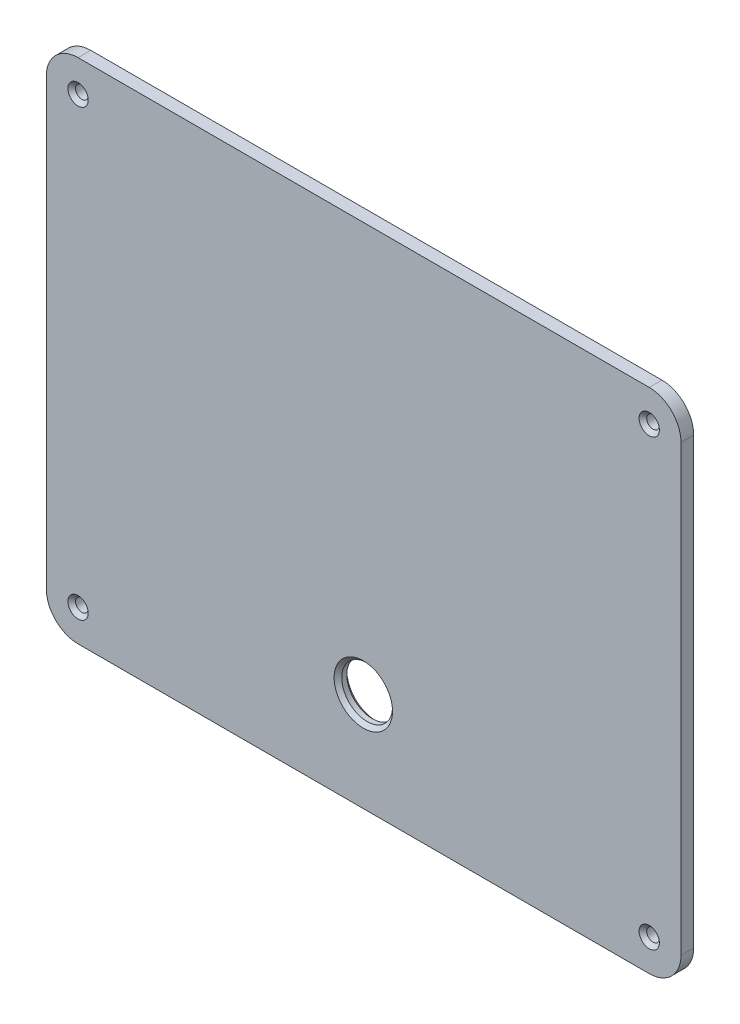
ISO-10303-21;
HEADER;
FILE_DESCRIPTION(('STEP AP214'),'2;1');
FILE_NAME('part.step','',(''),(''),'','','');
FILE_SCHEMA(('AUTOMOTIVE_DESIGN { 1 0 10303 214 1 1 1 1 }'));
ENDSEC;
DATA;
#1=APPLICATION_CONTEXT('core data for automotive mechanical design processes');
#2=APPLICATION_PROTOCOL_DEFINITION('international standard','automotive_design',2000,#1);
#3=PRODUCT_CONTEXT('',#1,'mechanical');
#4=PRODUCT('Part','Part','',(#3));
#5=PRODUCT_RELATED_PRODUCT_CATEGORY('part','',(#4));
#6=PRODUCT_DEFINITION_FORMATION('','',#4);
#7=PRODUCT_DEFINITION_CONTEXT('part definition',#1,'design');
#8=PRODUCT_DEFINITION('design','',#6,#7);
#9=PRODUCT_DEFINITION_SHAPE('','',#8);
#10=(LENGTH_UNIT() NAMED_UNIT(*) SI_UNIT(.MILLI.,.METRE.));
#11=(NAMED_UNIT(*) PLANE_ANGLE_UNIT() SI_UNIT($,.RADIAN.));
#12=(NAMED_UNIT(*) SI_UNIT($,.STERADIAN.) SOLID_ANGLE_UNIT());
#13=UNCERTAINTY_MEASURE_WITH_UNIT(LENGTH_MEASURE(1.E-05),#10,'distance_accuracy_value','');
#14=(GEOMETRIC_REPRESENTATION_CONTEXT(3) GLOBAL_UNCERTAINTY_ASSIGNED_CONTEXT((#13)) GLOBAL_UNIT_ASSIGNED_CONTEXT((#10,
#11,#12)) REPRESENTATION_CONTEXT('',''));
#15=CARTESIAN_POINT('',(0.,0.,0.));
#16=DIRECTION('',(0.,0.,1.));
#17=DIRECTION('',(1.,0.,0.));
#18=AXIS2_PLACEMENT_3D('',#15,#16,#17);
#19=CARTESIAN_POINT('',(-224.722989012424,-174.030461543485,10.));
#20=DIRECTION('',(0.,0.,-1.));
#21=DIRECTION('',(-1.,0.,0.));
#22=AXIS2_PLACEMENT_3D('',#19,#20,#21);
#23=CYLINDRICAL_SURFACE('',#22,25.);
#24=CARTESIAN_POINT('',(-224.722989012424,-174.030461543485,0.));
#25=DIRECTION('',(0.,0.,1.));
#26=DIRECTION('',(1.,0.,0.));
#27=AXIS2_PLACEMENT_3D('',#24,#25,#26);
#28=CIRCLE('',#27,25.);
#29=CARTESIAN_POINT('',(-249.722989012424,-174.030461543485,0.));
#30=VERTEX_POINT('',#29);
#31=CARTESIAN_POINT('',(-224.722989012424,-199.030461543485,0.));
#32=VERTEX_POINT('',#31);
#33=EDGE_CURVE('E136',#30,#32,#28,.T.);
#34=ORIENTED_EDGE('',*,*,#33,.T.);
#35=DIRECTION('',(0.,0.,-1.));
#36=VECTOR('',#35,1.);
#37=CARTESIAN_POINT('',(-224.722989012424,-199.030461543485,10.));
#38=LINE('',#37,#36);
#39=CARTESIAN_POINT('',(-224.722989012424,-199.030461543485,10.));
#40=VERTEX_POINT('',#39);
#41=EDGE_CURVE('E164',#40,#32,#38,.T.);
#42=ORIENTED_EDGE('',*,*,#41,.F.);
#43=CARTESIAN_POINT('',(-224.722989012424,-174.030461543485,10.));
#44=DIRECTION('',(0.,0.,1.));
#45=DIRECTION('',(1.,0.,0.));
#46=AXIS2_PLACEMENT_3D('',#43,#44,#45);
#47=CIRCLE('',#46,25.);
#48=CARTESIAN_POINT('',(-249.722989012424,-174.030461543485,10.));
#49=VERTEX_POINT('',#48);
#50=EDGE_CURVE('E151',#49,#40,#47,.T.);
#51=ORIENTED_EDGE('',*,*,#50,.F.);
#52=DIRECTION('',(0.,0.,-1.));
#53=VECTOR('',#52,1.);
#54=CARTESIAN_POINT('',(-249.722989012424,-174.030461543485,10.));
#55=LINE('',#54,#53);
#56=EDGE_CURVE('E132',#49,#30,#55,.T.);
#57=ORIENTED_EDGE('',*,*,#56,.T.);
#58=EDGE_LOOP('',(#34,#42,#51,#57));
#59=FACE_BOUND('',#58,.T.);
#60=ADVANCED_FACE('F37',(#59),#23,.T.);
#61=CARTESIAN_POINT('',(-224.722989012424,-199.030461543485,10.));
#62=DIRECTION('',(0.,1.,0.));
#63=DIRECTION('',(-1.,0.,0.));
#64=AXIS2_PLACEMENT_3D('',#61,#62,#63);
#65=PLANE('',#64);
#66=DIRECTION('',(1.,0.,0.));
#67=VECTOR('',#66,1.);
#68=CARTESIAN_POINT('',(-224.722989012424,-199.030461543485,0.));
#69=LINE('',#68,#67);
#70=CARTESIAN_POINT('',(225.277010987576,-199.030461543485,0.));
#71=VERTEX_POINT('',#70);
#72=EDGE_CURVE('E139',#32,#71,#69,.T.);
#73=ORIENTED_EDGE('',*,*,#72,.T.);
#74=DIRECTION('',(0.,0.,-1.));
#75=VECTOR('',#74,1.);
#76=CARTESIAN_POINT('',(225.277010987576,-199.030461543485,10.));
#77=LINE('',#76,#75);
#78=CARTESIAN_POINT('',(225.277010987576,-199.030461543485,10.));
#79=VERTEX_POINT('',#78);
#80=EDGE_CURVE('E161',#79,#71,#77,.T.);
#81=ORIENTED_EDGE('',*,*,#80,.F.);
#82=DIRECTION('',(1.,0.,0.));
#83=VECTOR('',#82,1.);
#84=CARTESIAN_POINT('',(-224.722989012424,-199.030461543485,10.));
#85=LINE('',#84,#83);
#86=EDGE_CURVE('E99',#40,#79,#85,.T.);
#87=ORIENTED_EDGE('',*,*,#86,.F.);
#88=ORIENTED_EDGE('',*,*,#41,.T.);
#89=EDGE_LOOP('',(#73,#81,#87,#88));
#90=FACE_BOUND('',#89,.T.);
#91=ADVANCED_FACE('F243',(#90),#65,.F.);
#92=CARTESIAN_POINT('',(225.277010987576,-174.030461543485,10.));
#93=DIRECTION('',(0.,0.,-1.));
#94=DIRECTION('',(-1.,0.,0.));
#95=AXIS2_PLACEMENT_3D('',#92,#93,#94);
#96=CYLINDRICAL_SURFACE('',#95,25.);
#97=CARTESIAN_POINT('',(225.277010987576,-174.030461543485,0.));
#98=DIRECTION('',(0.,0.,1.));
#99=DIRECTION('',(1.,0.,0.));
#100=AXIS2_PLACEMENT_3D('',#97,#98,#99);
#101=CIRCLE('',#100,25.);
#102=CARTESIAN_POINT('',(250.277010987576,-174.030461543485,0.));
#103=VERTEX_POINT('',#102);
#104=EDGE_CURVE('E142',#71,#103,#101,.T.);
#105=ORIENTED_EDGE('',*,*,#104,.T.);
#106=DIRECTION('',(0.,0.,-1.));
#107=VECTOR('',#106,1.);
#108=CARTESIAN_POINT('',(250.277010987576,-174.030461543485,10.));
#109=LINE('',#108,#107);
#110=CARTESIAN_POINT('',(250.277010987576,-174.030461543485,10.));
#111=VERTEX_POINT('',#110);
#112=EDGE_CURVE('E158',#111,#103,#109,.T.);
#113=ORIENTED_EDGE('',*,*,#112,.F.);
#114=CARTESIAN_POINT('',(225.277010987576,-174.030461543485,10.));
#115=DIRECTION('',(0.,0.,1.));
#116=DIRECTION('',(1.,0.,0.));
#117=AXIS2_PLACEMENT_3D('',#114,#115,#116);
#118=CIRCLE('',#117,25.);
#119=EDGE_CURVE('E305',#79,#111,#118,.T.);
#120=ORIENTED_EDGE('',*,*,#119,.F.);
#121=ORIENTED_EDGE('',*,*,#80,.T.);
#122=EDGE_LOOP('',(#105,#113,#120,#121));
#123=FACE_BOUND('',#122,.T.);
#124=ADVANCED_FACE('F248',(#123),#96,.T.);
#125=CARTESIAN_POINT('',(250.277010987576,-174.030461543485,10.));
#126=DIRECTION('',(-1.,0.,0.));
#127=DIRECTION('',(0.,0.,1.));
#128=AXIS2_PLACEMENT_3D('',#125,#126,#127);
#129=PLANE('',#128);
#130=DIRECTION('',(0.,1.,0.));
#131=VECTOR('',#130,1.);
#132=CARTESIAN_POINT('',(250.277010987576,-174.030461543485,0.));
#133=LINE('',#132,#131);
#134=CARTESIAN_POINT('',(250.277010987576,175.969538456515,0.));
#135=VERTEX_POINT('',#134);
#136=EDGE_CURVE('E144',#103,#135,#133,.T.);
#137=ORIENTED_EDGE('',*,*,#136,.T.);
#138=DIRECTION('',(0.,0.,-1.));
#139=VECTOR('',#138,1.);
#140=CARTESIAN_POINT('',(250.277010987576,175.969538456515,10.));
#141=LINE('',#140,#139);
#142=CARTESIAN_POINT('',(250.277010987576,175.969538456515,10.));
#143=VERTEX_POINT('',#142);
#144=EDGE_CURVE('E155',#143,#135,#141,.T.);
#145=ORIENTED_EDGE('',*,*,#144,.F.);
#146=DIRECTION('',(0.,1.,0.));
#147=VECTOR('',#146,1.);
#148=CARTESIAN_POINT('',(250.277010987576,-174.030461543485,10.));
#149=LINE('',#148,#147);
#150=EDGE_CURVE('E307',#111,#143,#149,.T.);
#151=ORIENTED_EDGE('',*,*,#150,.F.);
#152=ORIENTED_EDGE('',*,*,#112,.T.);
#153=EDGE_LOOP('',(#137,#145,#151,#152));
#154=FACE_BOUND('',#153,.T.);
#155=ADVANCED_FACE('F313',(#154),#129,.F.);
#156=CARTESIAN_POINT('',(225.277010987576,175.969538456515,10.));
#157=DIRECTION('',(0.,0.,-1.));
#158=DIRECTION('',(-1.,0.,0.));
#159=AXIS2_PLACEMENT_3D('',#156,#157,#158);
#160=CYLINDRICAL_SURFACE('',#159,25.);
#161=CARTESIAN_POINT('',(225.277010987576,175.969538456515,0.));
#162=DIRECTION('',(0.,0.,1.));
#163=DIRECTION('',(1.,0.,0.));
#164=AXIS2_PLACEMENT_3D('',#161,#162,#163);
#165=CIRCLE('',#164,25.);
#166=CARTESIAN_POINT('',(225.277010987576,200.969538456515,0.));
#167=VERTEX_POINT('',#166);
#168=EDGE_CURVE('E146',#135,#167,#165,.T.);
#169=ORIENTED_EDGE('',*,*,#168,.T.);
#170=DIRECTION('',(0.,0.,-1.));
#171=VECTOR('',#170,1.);
#172=CARTESIAN_POINT('',(225.277010987576,200.969538456515,10.));
#173=LINE('',#172,#171);
#174=CARTESIAN_POINT('',(225.277010987576,200.969538456515,10.));
#175=VERTEX_POINT('',#174);
#176=EDGE_CURVE('E127',#175,#167,#173,.T.);
#177=ORIENTED_EDGE('',*,*,#176,.F.);
#178=CARTESIAN_POINT('',(225.277010987576,175.969538456515,10.));
#179=DIRECTION('',(0.,0.,1.));
#180=DIRECTION('',(1.,0.,0.));
#181=AXIS2_PLACEMENT_3D('',#178,#179,#180);
#182=CIRCLE('',#181,25.);
#183=EDGE_CURVE('E118',#143,#175,#182,.T.);
#184=ORIENTED_EDGE('',*,*,#183,.F.);
#185=ORIENTED_EDGE('',*,*,#144,.T.);
#186=EDGE_LOOP('',(#169,#177,#184,#185));
#187=FACE_BOUND('',#186,.T.);
#188=ADVANCED_FACE('F317',(#187),#160,.T.);
#189=CARTESIAN_POINT('',(225.277010987576,200.969538456515,10.));
#190=DIRECTION('',(0.,-1.,0.));
#191=DIRECTION('',(1.,0.,0.));
#192=AXIS2_PLACEMENT_3D('',#189,#190,#191);
#193=PLANE('',#192);
#194=DIRECTION('',(-1.,0.,0.));
#195=VECTOR('',#194,1.);
#196=CARTESIAN_POINT('',(225.277010987576,200.969538456515,0.));
#197=LINE('',#196,#195);
#198=CARTESIAN_POINT('',(-224.722989012424,200.969538456515,0.));
#199=VERTEX_POINT('',#198);
#200=EDGE_CURVE('E126',#167,#199,#197,.T.);
#201=ORIENTED_EDGE('',*,*,#200,.T.);
#202=DIRECTION('',(0.,0.,-1.));
#203=VECTOR('',#202,1.);
#204=CARTESIAN_POINT('',(-224.722989012424,200.969538456515,10.));
#205=LINE('',#204,#203);
#206=CARTESIAN_POINT('',(-224.722989012424,200.969538456515,10.));
#207=VERTEX_POINT('',#206);
#208=EDGE_CURVE('E123',#207,#199,#205,.T.);
#209=ORIENTED_EDGE('',*,*,#208,.F.);
#210=DIRECTION('',(-1.,0.,0.));
#211=VECTOR('',#210,1.);
#212=CARTESIAN_POINT('',(225.277010987576,200.969538456515,10.));
#213=LINE('',#212,#211);
#214=EDGE_CURVE('E112',#175,#207,#213,.T.);
#215=ORIENTED_EDGE('',*,*,#214,.F.);
#216=ORIENTED_EDGE('',*,*,#176,.T.);
#217=EDGE_LOOP('',(#201,#209,#215,#216));
#218=FACE_BOUND('',#217,.T.);
#219=ADVANCED_FACE('F124',(#218),#193,.F.);
#220=CARTESIAN_POINT('',(-224.722989012424,175.969538456515,10.));
#221=DIRECTION('',(0.,0.,-1.));
#222=DIRECTION('',(-1.,0.,0.));
#223=AXIS2_PLACEMENT_3D('',#220,#221,#222);
#224=CYLINDRICAL_SURFACE('',#223,25.);
#225=CARTESIAN_POINT('',(-224.722989012424,175.969538456515,0.));
#226=DIRECTION('',(0.,0.,1.));
#227=DIRECTION('',(1.,0.,0.));
#228=AXIS2_PLACEMENT_3D('',#225,#226,#227);
#229=CIRCLE('',#228,25.);
#230=CARTESIAN_POINT('',(-249.722989012424,175.969538456515,0.));
#231=VERTEX_POINT('',#230);
#232=EDGE_CURVE('E84',#199,#231,#229,.T.);
#233=ORIENTED_EDGE('',*,*,#232,.T.);
#234=DIRECTION('',(0.,0.,-1.));
#235=VECTOR('',#234,1.);
#236=CARTESIAN_POINT('',(-249.722989012424,175.969538456515,10.));
#237=LINE('',#236,#235);
#238=CARTESIAN_POINT('',(-249.722989012424,175.969538456515,10.));
#239=VERTEX_POINT('',#238);
#240=EDGE_CURVE('E128',#239,#231,#237,.T.);
#241=ORIENTED_EDGE('',*,*,#240,.F.);
#242=CARTESIAN_POINT('',(-224.722989012424,175.969538456515,10.));
#243=DIRECTION('',(0.,0.,1.));
#244=DIRECTION('',(1.,0.,0.));
#245=AXIS2_PLACEMENT_3D('',#242,#243,#244);
#246=CIRCLE('',#245,25.);
#247=EDGE_CURVE('E116',#207,#239,#246,.T.);
#248=ORIENTED_EDGE('',*,*,#247,.F.);
#249=ORIENTED_EDGE('',*,*,#208,.T.);
#250=EDGE_LOOP('',(#233,#241,#248,#249));
#251=FACE_BOUND('',#250,.T.);
#252=ADVANCED_FACE('F130',(#251),#224,.T.);
#253=CARTESIAN_POINT('',(-249.722989012424,175.969538456515,10.));
#254=DIRECTION('',(1.,0.,0.));
#255=DIRECTION('',(0.,1.,0.));
#256=AXIS2_PLACEMENT_3D('',#253,#254,#255);
#257=PLANE('',#256);
#258=DIRECTION('',(0.,-1.,0.));
#259=VECTOR('',#258,1.);
#260=CARTESIAN_POINT('',(-249.722989012424,175.969538456515,0.));
#261=LINE('',#260,#259);
#262=EDGE_CURVE('E90',#231,#30,#261,.T.);
#263=ORIENTED_EDGE('',*,*,#262,.T.);
#264=ORIENTED_EDGE('',*,*,#56,.F.);
#265=DIRECTION('',(0.,-1.,0.));
#266=VECTOR('',#265,1.);
#267=CARTESIAN_POINT('',(-249.722989012424,175.969538456515,10.));
#268=LINE('',#267,#266);
#269=EDGE_CURVE('E55',#239,#49,#268,.T.);
#270=ORIENTED_EDGE('',*,*,#269,.F.);
#271=ORIENTED_EDGE('',*,*,#240,.T.);
#272=EDGE_LOOP('',(#263,#264,#270,#271));
#273=FACE_BOUND('',#272,.T.);
#274=ADVANCED_FACE('F231',(#273),#257,.F.);
#275=CARTESIAN_POINT('',(-224.722989012424,-174.030461543485,10.));
#276=DIRECTION('',(0.,0.,1.));
#277=DIRECTION('',(1.,0.,0.));
#278=AXIS2_PLACEMENT_3D('',#275,#276,#277);
#279=PLANE('',#278);
#280=CARTESIAN_POINT('',(0.,-121.160461543485,10.));
#281=DIRECTION('',(0.,0.,1.));
#282=DIRECTION('',(1.,0.,0.));
#283=AXIS2_PLACEMENT_3D('',#280,#281,#282);
#284=CIRCLE('',#283,23.0000000000001);
#285=CARTESIAN_POINT('',(23.0000000000001,-121.160461543485,10.));
#286=VERTEX_POINT('',#285);
#287=EDGE_CURVE('E11',#286,#286,#284,.F.);
#288=ORIENTED_EDGE('',*,*,#287,.T.);
#289=EDGE_LOOP('',(#288));
#290=FACE_BOUND('',#289,.T.);
#291=CARTESIAN_POINT('',(225.277010987576,175.969538456515,10.));
#292=DIRECTION('',(0.,0.,1.));
#293=DIRECTION('',(1.,0.,0.));
#294=AXIS2_PLACEMENT_3D('',#291,#292,#293);
#295=CIRCLE('',#294,8.00000000000012);
#296=CARTESIAN_POINT('',(233.277010987576,175.969538456515,10.));
#297=VERTEX_POINT('',#296);
#298=EDGE_CURVE('E178',#297,#297,#295,.F.);
#299=ORIENTED_EDGE('',*,*,#298,.T.);
#300=EDGE_LOOP('',(#299));
#301=FACE_BOUND('',#300,.T.);
#302=CARTESIAN_POINT('',(225.277010987576,-174.030461543485,10.));
#303=DIRECTION('',(0.,0.,1.));
#304=DIRECTION('',(1.,0.,0.));
#305=AXIS2_PLACEMENT_3D('',#302,#303,#304);
#306=CIRCLE('',#305,8.00000000000012);
#307=CARTESIAN_POINT('',(233.277010987576,-174.030461543485,10.));
#308=VERTEX_POINT('',#307);
#309=EDGE_CURVE('E175',#308,#308,#306,.F.);
#310=ORIENTED_EDGE('',*,*,#309,.T.);
#311=EDGE_LOOP('',(#310));
#312=FACE_BOUND('',#311,.T.);
#313=CARTESIAN_POINT('',(-224.722989012424,-174.030461543485,10.));
#314=DIRECTION('',(0.,0.,1.));
#315=DIRECTION('',(1.,0.,0.));
#316=AXIS2_PLACEMENT_3D('',#313,#314,#315);
#317=CIRCLE('',#316,8.00000000000015);
#318=CARTESIAN_POINT('',(-216.722989012424,-174.030461543485,10.));
#319=VERTEX_POINT('',#318);
#320=EDGE_CURVE('E172',#319,#319,#317,.F.);
#321=ORIENTED_EDGE('',*,*,#320,.T.);
#322=EDGE_LOOP('',(#321));
#323=FACE_BOUND('',#322,.T.);
#324=CARTESIAN_POINT('',(-224.722989012424,175.969538456515,10.));
#325=DIRECTION('',(0.,0.,1.));
#326=DIRECTION('',(1.,0.,0.));
#327=AXIS2_PLACEMENT_3D('',#324,#325,#326);
#328=CIRCLE('',#327,8.00000000000012);
#329=CARTESIAN_POINT('',(-216.722989012424,175.969538456515,10.));
#330=VERTEX_POINT('',#329);
#331=EDGE_CURVE('E169',#330,#330,#328,.F.);
#332=ORIENTED_EDGE('',*,*,#331,.T.);
#333=EDGE_LOOP('',(#332));
#334=FACE_BOUND('',#333,.T.);
#335=ORIENTED_EDGE('',*,*,#50,.T.);
#336=ORIENTED_EDGE('',*,*,#86,.T.);
#337=ORIENTED_EDGE('',*,*,#119,.T.);
#338=ORIENTED_EDGE('',*,*,#150,.T.);
#339=ORIENTED_EDGE('',*,*,#183,.T.);
#340=ORIENTED_EDGE('',*,*,#214,.T.);
#341=ORIENTED_EDGE('',*,*,#247,.T.);
#342=ORIENTED_EDGE('',*,*,#269,.T.);
#343=EDGE_LOOP('',(#335,#336,#337,#338,#339,#340,#341,#342));
#344=FACE_BOUND('',#343,.T.);
#345=ADVANCED_FACE('F114',(#290,#301,#312,#323,#334,#344),#279,.T.);
#346=CARTESIAN_POINT('',(-224.722989012424,-174.030461543485,0.));
#347=DIRECTION('',(0.,0.,1.));
#348=DIRECTION('',(1.,0.,0.));
#349=AXIS2_PLACEMENT_3D('',#346,#347,#348);
#350=PLANE('',#349);
#351=CARTESIAN_POINT('',(0.,-121.160461543485,0.));
#352=DIRECTION('',(0.,0.,1.));
#353=DIRECTION('',(1.,0.,0.));
#354=AXIS2_PLACEMENT_3D('',#351,#352,#353);
#355=CIRCLE('',#354,23.0000000000001);
#356=CARTESIAN_POINT('',(23.0000000000001,-121.160461543485,0.));
#357=VERTEX_POINT('',#356);
#358=EDGE_CURVE('E190',#357,#357,#355,.T.);
#359=ORIENTED_EDGE('',*,*,#358,.T.);
#360=EDGE_LOOP('',(#359));
#361=FACE_BOUND('',#360,.T.);
#362=CARTESIAN_POINT('',(-224.722989012424,175.969538456515,0.));
#363=DIRECTION('',(0.,0.,1.));
#364=DIRECTION('',(1.,0.,0.));
#365=AXIS2_PLACEMENT_3D('',#362,#363,#364);
#366=CIRCLE('',#365,4.99999999999999);
#367=CARTESIAN_POINT('',(-219.722989012424,175.969538456515,0.));
#368=VERTEX_POINT('',#367);
#369=EDGE_CURVE('E214',#368,#368,#366,.T.);
#370=ORIENTED_EDGE('',*,*,#369,.T.);
#371=EDGE_LOOP('',(#370));
#372=FACE_BOUND('',#371,.T.);
#373=CARTESIAN_POINT('',(225.277010987576,175.969538456515,0.));
#374=DIRECTION('',(0.,0.,1.));
#375=DIRECTION('',(1.,0.,0.));
#376=AXIS2_PLACEMENT_3D('',#373,#374,#375);
#377=CIRCLE('',#376,4.99999999999999);
#378=CARTESIAN_POINT('',(230.277010987576,175.969538456515,0.));
#379=VERTEX_POINT('',#378);
#380=EDGE_CURVE('E218',#379,#379,#377,.T.);
#381=ORIENTED_EDGE('',*,*,#380,.T.);
#382=EDGE_LOOP('',(#381));
#383=FACE_BOUND('',#382,.T.);
#384=CARTESIAN_POINT('',(225.277010987576,-174.030461543485,0.));
#385=DIRECTION('',(0.,0.,1.));
#386=DIRECTION('',(1.,0.,0.));
#387=AXIS2_PLACEMENT_3D('',#384,#385,#386);
#388=CIRCLE('',#387,4.99999999999999);
#389=CARTESIAN_POINT('',(230.277010987576,-174.030461543485,0.));
#390=VERTEX_POINT('',#389);
#391=EDGE_CURVE('E222',#390,#390,#388,.T.);
#392=ORIENTED_EDGE('',*,*,#391,.T.);
#393=EDGE_LOOP('',(#392));
#394=FACE_BOUND('',#393,.T.);
#395=CARTESIAN_POINT('',(-224.722989012424,-174.030461543485,0.));
#396=DIRECTION('',(0.,0.,1.));
#397=DIRECTION('',(1.,0.,0.));
#398=AXIS2_PLACEMENT_3D('',#395,#396,#397);
#399=CIRCLE('',#398,5.00000000000002);
#400=CARTESIAN_POINT('',(-219.722989012424,-174.030461543485,0.));
#401=VERTEX_POINT('',#400);
#402=EDGE_CURVE('E140',#401,#401,#399,.T.);
#403=ORIENTED_EDGE('',*,*,#402,.T.);
#404=EDGE_LOOP('',(#403));
#405=FACE_BOUND('',#404,.T.);
#406=ORIENTED_EDGE('',*,*,#33,.F.);
#407=ORIENTED_EDGE('',*,*,#262,.F.);
#408=ORIENTED_EDGE('',*,*,#232,.F.);
#409=ORIENTED_EDGE('',*,*,#200,.F.);
#410=ORIENTED_EDGE('',*,*,#168,.F.);
#411=ORIENTED_EDGE('',*,*,#136,.F.);
#412=ORIENTED_EDGE('',*,*,#104,.F.);
#413=ORIENTED_EDGE('',*,*,#72,.F.);
#414=EDGE_LOOP('',(#406,#407,#408,#409,#410,#411,#412,#413));
#415=FACE_BOUND('',#414,.T.);
#416=ADVANCED_FACE('F206',(#361,#372,#383,#394,#405,#415),#350,.F.);
#417=CARTESIAN_POINT('',(-224.722989012424,-174.030461543485,0.));
#418=DIRECTION('',(0.,0.,1.));
#419=DIRECTION('',(1.,0.,0.));
#420=AXIS2_PLACEMENT_3D('',#417,#418,#419);
#421=CYLINDRICAL_SURFACE('',#420,5.00000000000002);
#422=CARTESIAN_POINT('',(-224.722989012424,-174.030461543485,6.99999999999994));
#423=DIRECTION('',(0.,0.,1.));
#424=DIRECTION('',(1.,0.,0.));
#425=AXIS2_PLACEMENT_3D('',#422,#423,#424);
#426=CIRCLE('',#425,5.00000000000002);
#427=CARTESIAN_POINT('',(-219.722989012424,-174.030461543485,6.99999999999994));
#428=VERTEX_POINT('',#427);
#429=EDGE_CURVE('E184',#428,#428,#426,.T.);
#430=ORIENTED_EDGE('',*,*,#429,.T.);
#431=EDGE_LOOP('',(#430));
#432=FACE_BOUND('',#431,.T.);
#433=ORIENTED_EDGE('',*,*,#402,.F.);
#434=EDGE_LOOP('',(#433));
#435=FACE_BOUND('',#434,.T.);
#436=ADVANCED_FACE('F209',(#432,#435),#421,.F.);
#437=CARTESIAN_POINT('',(225.277010987576,-174.030461543485,0.));
#438=DIRECTION('',(0.,0.,1.));
#439=DIRECTION('',(1.,0.,0.));
#440=AXIS2_PLACEMENT_3D('',#437,#438,#439);
#441=CYLINDRICAL_SURFACE('',#440,4.99999999999999);
#442=CARTESIAN_POINT('',(225.277010987576,-174.030461543485,6.99999999999991));
#443=DIRECTION('',(0.,0.,1.));
#444=DIRECTION('',(1.,0.,0.));
#445=AXIS2_PLACEMENT_3D('',#442,#443,#444);
#446=CIRCLE('',#445,4.99999999999999);
#447=CARTESIAN_POINT('',(230.277010987576,-174.030461543485,6.99999999999991));
#448=VERTEX_POINT('',#447);
#449=EDGE_CURVE('E181',#448,#448,#446,.T.);
#450=ORIENTED_EDGE('',*,*,#449,.T.);
#451=EDGE_LOOP('',(#450));
#452=FACE_BOUND('',#451,.T.);
#453=ORIENTED_EDGE('',*,*,#391,.F.);
#454=EDGE_LOOP('',(#453));
#455=FACE_BOUND('',#454,.T.);
#456=ADVANCED_FACE('F350',(#452,#455),#441,.F.);
#457=CARTESIAN_POINT('',(225.277010987576,175.969538456515,0.));
#458=DIRECTION('',(0.,0.,1.));
#459=DIRECTION('',(1.,0.,0.));
#460=AXIS2_PLACEMENT_3D('',#457,#458,#459);
#461=CYLINDRICAL_SURFACE('',#460,4.99999999999999);
#462=CARTESIAN_POINT('',(225.277010987576,175.969538456515,6.99999999999991));
#463=DIRECTION('',(0.,0.,1.));
#464=DIRECTION('',(1.,0.,0.));
#465=AXIS2_PLACEMENT_3D('',#462,#463,#464);
#466=CIRCLE('',#465,4.99999999999999);
#467=CARTESIAN_POINT('',(230.277010987576,175.969538456515,6.99999999999991));
#468=VERTEX_POINT('',#467);
#469=EDGE_CURVE('E166',#468,#468,#466,.T.);
#470=ORIENTED_EDGE('',*,*,#469,.T.);
#471=EDGE_LOOP('',(#470));
#472=FACE_BOUND('',#471,.T.);
#473=ORIENTED_EDGE('',*,*,#380,.F.);
#474=EDGE_LOOP('',(#473));
#475=FACE_BOUND('',#474,.T.);
#476=ADVANCED_FACE('F296',(#472,#475),#461,.F.);
#477=CARTESIAN_POINT('',(-224.722989012424,175.969538456515,0.));
#478=DIRECTION('',(0.,0.,1.));
#479=DIRECTION('',(1.,0.,0.));
#480=AXIS2_PLACEMENT_3D('',#477,#478,#479);
#481=CYLINDRICAL_SURFACE('',#480,4.99999999999999);
#482=CARTESIAN_POINT('',(-224.722989012424,175.969538456515,6.99999999999991));
#483=DIRECTION('',(0.,0.,1.));
#484=DIRECTION('',(1.,0.,0.));
#485=AXIS2_PLACEMENT_3D('',#482,#483,#484);
#486=CIRCLE('',#485,4.99999999999999);
#487=CARTESIAN_POINT('',(-219.722989012424,175.969538456515,6.99999999999991));
#488=VERTEX_POINT('',#487);
#489=EDGE_CURVE('E187',#488,#488,#486,.T.);
#490=ORIENTED_EDGE('',*,*,#489,.T.);
#491=EDGE_LOOP('',(#490));
#492=FACE_BOUND('',#491,.T.);
#493=ORIENTED_EDGE('',*,*,#369,.F.);
#494=EDGE_LOOP('',(#493));
#495=FACE_BOUND('',#494,.T.);
#496=ADVANCED_FACE('F260',(#492,#495),#481,.F.);
#497=CARTESIAN_POINT('',(225.277010987576,175.969538456515,6.99999999999991));
#498=DIRECTION('',(0.,0.,1.));
#499=DIRECTION('',(1.,0.,0.));
#500=AXIS2_PLACEMENT_3D('',#497,#498,#499);
#501=CONICAL_SURFACE('',#500,4.99999999999999,0.785398163397455);
#502=ORIENTED_EDGE('',*,*,#298,.F.);
#503=EDGE_LOOP('',(#502));
#504=FACE_BOUND('',#503,.T.);
#505=ORIENTED_EDGE('',*,*,#469,.F.);
#506=EDGE_LOOP('',(#505));
#507=FACE_BOUND('',#506,.T.);
#508=ADVANCED_FACE('F253',(#504,#507),#501,.F.);
#509=CARTESIAN_POINT('',(225.277010987576,-174.030461543485,6.99999999999991));
#510=DIRECTION('',(0.,0.,1.));
#511=DIRECTION('',(1.,0.,0.));
#512=AXIS2_PLACEMENT_3D('',#509,#510,#511);
#513=CONICAL_SURFACE('',#512,4.99999999999999,0.785398163397455);
#514=ORIENTED_EDGE('',*,*,#309,.F.);
#515=EDGE_LOOP('',(#514));
#516=FACE_BOUND('',#515,.T.);
#517=ORIENTED_EDGE('',*,*,#449,.F.);
#518=EDGE_LOOP('',(#517));
#519=FACE_BOUND('',#518,.T.);
#520=ADVANCED_FACE('F259',(#516,#519),#513,.F.);
#521=CARTESIAN_POINT('',(-224.722989012424,-174.030461543485,6.99999999999994));
#522=DIRECTION('',(0.,0.,1.));
#523=DIRECTION('',(1.,0.,0.));
#524=AXIS2_PLACEMENT_3D('',#521,#522,#523);
#525=CONICAL_SURFACE('',#524,5.00000000000002,0.785398163397459);
#526=ORIENTED_EDGE('',*,*,#320,.F.);
#527=EDGE_LOOP('',(#526));
#528=FACE_BOUND('',#527,.T.);
#529=ORIENTED_EDGE('',*,*,#429,.F.);
#530=EDGE_LOOP('',(#529));
#531=FACE_BOUND('',#530,.T.);
#532=ADVANCED_FACE('F267',(#528,#531),#525,.F.);
#533=CARTESIAN_POINT('',(-224.722989012424,175.969538456515,6.99999999999991));
#534=DIRECTION('',(0.,0.,1.));
#535=DIRECTION('',(1.,0.,0.));
#536=AXIS2_PLACEMENT_3D('',#533,#534,#535);
#537=CONICAL_SURFACE('',#536,4.99999999999999,0.785398163397455);
#538=ORIENTED_EDGE('',*,*,#331,.F.);
#539=EDGE_LOOP('',(#538));
#540=FACE_BOUND('',#539,.T.);
#541=ORIENTED_EDGE('',*,*,#489,.F.);
#542=EDGE_LOOP('',(#541));
#543=FACE_BOUND('',#542,.T.);
#544=ADVANCED_FACE('F274',(#540,#543),#537,.F.);
#545=CARTESIAN_POINT('',(0.,-121.160461543485,0.));
#546=DIRECTION('',(0.,0.,1.));
#547=DIRECTION('',(1.,0.,0.));
#548=AXIS2_PLACEMENT_3D('',#545,#546,#547);
#549=CYLINDRICAL_SURFACE('',#548,20.);
#550=CARTESIAN_POINT('',(0.,-121.160461543485,3.00000000000011));
#551=DIRECTION('',(0.,0.,1.));
#552=DIRECTION('',(1.,0.,0.));
#553=AXIS2_PLACEMENT_3D('',#550,#551,#552);
#554=CIRCLE('',#553,20.);
#555=CARTESIAN_POINT('',(20.,-121.160461543485,3.00000000000011));
#556=VERTEX_POINT('',#555);
#557=EDGE_CURVE('E47',#556,#556,#554,.F.);
#558=ORIENTED_EDGE('',*,*,#557,.T.);
#559=EDGE_LOOP('',(#558));
#560=FACE_BOUND('',#559,.T.);
#561=CARTESIAN_POINT('',(0.,-121.160461543485,6.99999999999991));
#562=DIRECTION('',(0.,0.,1.));
#563=DIRECTION('',(1.,0.,0.));
#564=AXIS2_PLACEMENT_3D('',#561,#562,#563);
#565=CIRCLE('',#564,20.);
#566=CARTESIAN_POINT('',(20.,-121.160461543485,6.99999999999991));
#567=VERTEX_POINT('',#566);
#568=EDGE_CURVE('E193',#567,#567,#565,.T.);
#569=ORIENTED_EDGE('',*,*,#568,.T.);
#570=EDGE_LOOP('',(#569));
#571=FACE_BOUND('',#570,.T.);
#572=ADVANCED_FACE('F198',(#560,#571),#549,.F.);
#573=CARTESIAN_POINT('',(0.,-121.160461543485,0.));
#574=DIRECTION('',(0.,0.,-1.));
#575=DIRECTION('',(-1.,0.,0.));
#576=AXIS2_PLACEMENT_3D('',#573,#574,#575);
#577=CONICAL_SURFACE('',#576,23.0000000000001,0.785398163397442);
#578=ORIENTED_EDGE('',*,*,#557,.F.);
#579=EDGE_LOOP('',(#578));
#580=FACE_BOUND('',#579,.T.);
#581=ORIENTED_EDGE('',*,*,#358,.F.);
#582=EDGE_LOOP('',(#581));
#583=FACE_BOUND('',#582,.T.);
#584=ADVANCED_FACE('F201',(#580,#583),#577,.F.);
#585=CARTESIAN_POINT('',(0.,-121.160461543485,6.99999999999991));
#586=DIRECTION('',(0.,0.,1.));
#587=DIRECTION('',(1.,0.,0.));
#588=AXIS2_PLACEMENT_3D('',#585,#586,#587);
#589=CONICAL_SURFACE('',#588,20.,0.785398163397455);
#590=CARTESIAN_POINT('',(23.0000000000001,-121.160461543485,10.));
#591=CARTESIAN_POINT('',(22.9687500000001,-121.160461543485,9.96875));
#592=CARTESIAN_POINT('',(22.9375000000001,-121.160461543485,9.9375));
#593=CARTESIAN_POINT('',(22.8750000000001,-121.160461543485,9.875));
#594=CARTESIAN_POINT('',(22.8437500000001,-121.160461543485,9.84374999999999));
#595=CARTESIAN_POINT('',(22.7812500000001,-121.160461543485,9.78124999999999));
#596=CARTESIAN_POINT('',(22.7500000000001,-121.160461543485,9.74999999999999));
#597=CARTESIAN_POINT('',(22.6875000000001,-121.160461543485,9.68749999999999));
#598=CARTESIAN_POINT('',(22.6562500000001,-121.160461543485,9.65624999999999));
#599=CARTESIAN_POINT('',(22.5937500000001,-121.160461543485,9.59374999999999));
#600=CARTESIAN_POINT('',(22.5625000000001,-121.160461543485,9.56249999999999));
#601=CARTESIAN_POINT('',(22.5000000000001,-121.160461543485,9.49999999999998));
#602=CARTESIAN_POINT('',(22.4687500000001,-121.160461543485,9.46874999999999));
#603=CARTESIAN_POINT('',(22.4062500000001,-121.160461543485,9.40624999999998));
#604=CARTESIAN_POINT('',(22.3750000000001,-121.160461543485,9.37499999999998));
#605=CARTESIAN_POINT('',(22.3125000000001,-121.160461543485,9.31249999999998));
#606=CARTESIAN_POINT('',(22.2812500000001,-121.160461543485,9.28124999999998));
#607=CARTESIAN_POINT('',(22.2187500000001,-121.160461543485,9.21874999999998));
#608=CARTESIAN_POINT('',(22.1875000000001,-121.160461543485,9.18749999999998));
#609=CARTESIAN_POINT('',(22.1250000000001,-121.160461543485,9.12499999999998));
#610=CARTESIAN_POINT('',(22.0937500000001,-121.160461543485,9.09374999999997));
#611=CARTESIAN_POINT('',(22.0312500000001,-121.160461543485,9.03124999999997));
#612=CARTESIAN_POINT('',(22.0000000000001,-121.160461543485,8.99999999999997));
#613=CARTESIAN_POINT('',(21.9375000000001,-121.160461543485,8.93749999999997));
#614=CARTESIAN_POINT('',(21.9062500000001,-121.160461543485,8.90624999999997));
#615=CARTESIAN_POINT('',(21.8437500000001,-121.160461543485,8.84374999999997));
#616=CARTESIAN_POINT('',(21.8125000000001,-121.160461543485,8.81249999999997));
#617=CARTESIAN_POINT('',(21.7500000000001,-121.160461543485,8.74999999999996));
#618=CARTESIAN_POINT('',(21.7187500000001,-121.160461543485,8.71874999999996));
#619=CARTESIAN_POINT('',(21.6562500000001,-121.160461543485,8.65624999999996));
#620=CARTESIAN_POINT('',(21.6250000000001,-121.160461543485,8.62499999999996));
#621=CARTESIAN_POINT('',(21.5625000000001,-121.160461543485,8.56249999999996));
#622=CARTESIAN_POINT('',(21.5312500000001,-121.160461543485,8.53124999999996));
#623=CARTESIAN_POINT('',(21.4687500000001,-121.160461543485,8.46874999999996));
#624=CARTESIAN_POINT('',(21.4375000000001,-121.160461543485,8.43749999999996));
#625=CARTESIAN_POINT('',(21.3750000000001,-121.160461543485,8.37499999999995));
#626=CARTESIAN_POINT('',(21.3437500000001,-121.160461543485,8.34374999999995));
#627=CARTESIAN_POINT('',(21.2812500000001,-121.160461543485,8.28124999999995));
#628=CARTESIAN_POINT('',(21.2500000000001,-121.160461543485,8.24999999999995));
#629=CARTESIAN_POINT('',(21.1875000000001,-121.160461543485,8.18749999999995));
#630=CARTESIAN_POINT('',(21.1562500000001,-121.160461543485,8.15624999999995));
#631=CARTESIAN_POINT('',(21.0937500000001,-121.160461543485,8.09374999999994));
#632=CARTESIAN_POINT('',(21.0625,-121.160461543485,8.06249999999994));
#633=CARTESIAN_POINT('',(21.,-121.160461543485,7.99999999999994));
#634=CARTESIAN_POINT('',(20.96875,-121.160461543485,7.96874999999994));
#635=CARTESIAN_POINT('',(20.90625,-121.160461543485,7.90624999999994));
#636=CARTESIAN_POINT('',(20.875,-121.160461543485,7.87499999999994));
#637=CARTESIAN_POINT('',(20.8125,-121.160461543485,7.81249999999994));
#638=CARTESIAN_POINT('',(20.78125,-121.160461543485,7.78124999999994));
#639=CARTESIAN_POINT('',(20.71875,-121.160461543485,7.71874999999993));
#640=CARTESIAN_POINT('',(20.6875,-121.160461543485,7.68749999999993));
#641=CARTESIAN_POINT('',(20.625,-121.160461543485,7.62499999999993));
#642=CARTESIAN_POINT('',(20.59375,-121.160461543485,7.59374999999993));
#643=CARTESIAN_POINT('',(20.53125,-121.160461543485,7.53124999999993));
#644=CARTESIAN_POINT('',(20.5,-121.160461543485,7.49999999999993));
#645=CARTESIAN_POINT('',(20.4375,-121.160461543485,7.43749999999993));
#646=CARTESIAN_POINT('',(20.40625,-121.160461543485,7.40624999999993));
#647=CARTESIAN_POINT('',(20.34375,-121.160461543485,7.34374999999992));
#648=CARTESIAN_POINT('',(20.3125,-121.160461543485,7.31249999999992));
#649=CARTESIAN_POINT('',(20.25,-121.160461543485,7.24999999999992));
#650=CARTESIAN_POINT('',(20.21875,-121.160461543485,7.21874999999992));
#651=CARTESIAN_POINT('',(20.15625,-121.160461543485,7.15624999999992));
#652=CARTESIAN_POINT('',(20.125,-121.160461543485,7.12499999999992));
#653=CARTESIAN_POINT('',(20.0625,-121.160461543485,7.06249999999992));
#654=CARTESIAN_POINT('',(20.03125,-121.160461543485,7.03124999999991));
#655=CARTESIAN_POINT('',(20.,-121.160461543485,6.99999999999991));
#656=B_SPLINE_CURVE_WITH_KNOTS('',3,(#590,#591,#592,#593,#594,#595,#596,#597,#598,#599,#600,
#601,#602,#603,#604,#605,#606,#607,#608,#609,#610,#611,#612,#613,#614,#615,#616,#617,#618,#619,
#620,#621,#622,#623,#624,#625,#626,#627,#628,#629,#630,#631,#632,#633,#634,#635,#636,#637,#638,
#639,#640,#641,#642,#643,#644,#645,#646,#647,#648,#649,#650,#651,#652,#653,#654,#655),
.UNSPECIFIED.,.F.,.F.,(4,2,2,2,2,2,2,2,2,2,2,2,2,2,2,2,2,2,2,2,2,2,2,2,2,2,2,2,2,2,2,2,4),(0.,
0.132582521472483,0.265165042944964,0.397747564417447,0.530330085889928,0.662912607362411,
0.795495128834895,0.928077650307378,1.06066017177986,1.19324269325234,1.32582521472482,
1.45840773619731,1.59099025766979,1.72357277914227,1.85615530061475,1.98873782208724,
2.12132034355972,2.2539028650322,2.38648538650468,2.51906790797717,2.65165042944965,
2.78423295092213,2.91681547239461,3.04939799386709,3.18198051533958,3.31456303681206,
3.44714555828454,3.57972807975702,3.71231060122951,3.84489312270199,3.97747564417447,
4.11005816564695,4.24264068711943),.UNSPECIFIED.);
#657=EDGE_CURVE('BSEAM40',#286,#567,#656,.T.);
#658=ORIENTED_EDGE('',*,*,#287,.F.);
#659=ORIENTED_EDGE('',*,*,#568,.F.);
#660=ORIENTED_EDGE('',*,*,#657,.T.);
#661=ORIENTED_EDGE('',*,*,#657,.F.);
#662=EDGE_LOOP('',(#658,#660,#659,#661));
#663=FACE_BOUND('',#662,.T.);
#664=ADVANCED_FACE('F40',(#663),#589,.F.);
#665=CLOSED_SHELL('',(#60,#91,#124,#155,#188,#219,#252,#274,#345,#416,#436,#456,#476,#496,#508,
#520,#532,#544,#572,#584,#664));
#666=MANIFOLD_SOLID_BREP('B2',#665);
#667=ADVANCED_BREP_SHAPE_REPRESENTATION('',(#18,#666),#14);
#668=SHAPE_DEFINITION_REPRESENTATION(#9,#667);
ENDSEC;
END-ISO-10303-21;
